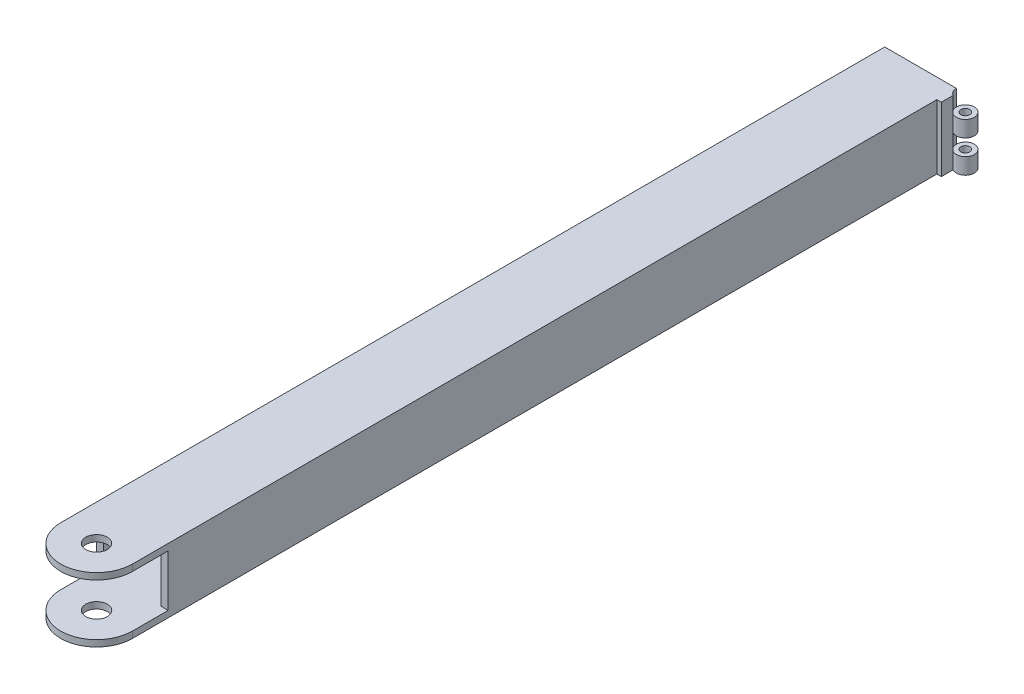
ISO-10303-21;
HEADER;
FILE_DESCRIPTION(('STEP AP214'),'2;1');
FILE_NAME('part.step','',(''),(''),'','','');
FILE_SCHEMA(('AUTOMOTIVE_DESIGN { 1 0 10303 214 1 1 1 1 }'));
ENDSEC;
DATA;
#1=APPLICATION_CONTEXT('core data for automotive mechanical design processes');
#2=APPLICATION_PROTOCOL_DEFINITION('international standard','automotive_design',2000,#1);
#3=PRODUCT_CONTEXT('',#1,'mechanical');
#4=PRODUCT('Part','Part','',(#3));
#5=PRODUCT_RELATED_PRODUCT_CATEGORY('part','',(#4));
#6=PRODUCT_DEFINITION_FORMATION('','',#4);
#7=PRODUCT_DEFINITION_CONTEXT('part definition',#1,'design');
#8=PRODUCT_DEFINITION('design','',#6,#7);
#9=PRODUCT_DEFINITION_SHAPE('','',#8);
#10=(LENGTH_UNIT() NAMED_UNIT(*) SI_UNIT(.MILLI.,.METRE.));
#11=(NAMED_UNIT(*) PLANE_ANGLE_UNIT() SI_UNIT($,.RADIAN.));
#12=(NAMED_UNIT(*) SI_UNIT($,.STERADIAN.) SOLID_ANGLE_UNIT());
#13=UNCERTAINTY_MEASURE_WITH_UNIT(LENGTH_MEASURE(1.E-05),#10,'distance_accuracy_value','');
#14=(GEOMETRIC_REPRESENTATION_CONTEXT(3) GLOBAL_UNCERTAINTY_ASSIGNED_CONTEXT((#13)) GLOBAL_UNIT_ASSIGNED_CONTEXT((#10,
#11,#12)) REPRESENTATION_CONTEXT('',''));
#15=CARTESIAN_POINT('',(0.,0.,0.));
#16=DIRECTION('',(0.,0.,1.));
#17=DIRECTION('',(1.,0.,0.));
#18=AXIS2_PLACEMENT_3D('',#15,#16,#17);
#19=CARTESIAN_POINT('',(25.,18.,0.));
#20=DIRECTION('',(0.,-1.,0.));
#21=DIRECTION('',(0.,0.,-1.));
#22=AXIS2_PLACEMENT_3D('',#19,#20,#21);
#23=CYLINDRICAL_SURFACE('',#22,5.);
#24=DIRECTION('',(0.,1.,0.));
#25=VECTOR('',#24,1.);
#26=CARTESIAN_POINT('',(20.,18.,0.));
#27=LINE('',#26,#25);
#28=CARTESIAN_POINT('',(20.,0.,0.));
#29=VERTEX_POINT('',#28);
#30=CARTESIAN_POINT('',(20.,9.,0.));
#31=VERTEX_POINT('',#30);
#32=EDGE_CURVE('E206',#29,#31,#27,.T.);
#33=ORIENTED_EDGE('',*,*,#32,.T.);
#34=CARTESIAN_POINT('',(25.,9.,0.));
#35=DIRECTION('',(0.,1.,0.));
#36=DIRECTION('',(0.,0.,1.));
#37=AXIS2_PLACEMENT_3D('',#34,#35,#36);
#38=CIRCLE('',#37,5.);
#39=CARTESIAN_POINT('',(22.5,9.,4.3301270189222));
#40=VERTEX_POINT('',#39);
#41=EDGE_CURVE('E194',#40,#31,#38,.T.);
#42=ORIENTED_EDGE('',*,*,#41,.F.);
#43=DIRECTION('',(0.,-1.,0.));
#44=VECTOR('',#43,1.);
#45=CARTESIAN_POINT('',(22.5,18.,4.33012701892219));
#46=LINE('',#45,#44);
#47=CARTESIAN_POINT('',(22.5,0.,4.33012701892219));
#48=VERTEX_POINT('',#47);
#49=EDGE_CURVE('E58',#40,#48,#46,.T.);
#50=ORIENTED_EDGE('',*,*,#49,.T.);
#51=CARTESIAN_POINT('',(25.,0.,0.));
#52=DIRECTION('',(0.,-1.,0.));
#53=DIRECTION('',(0.,0.,-1.));
#54=AXIS2_PLACEMENT_3D('',#51,#52,#53);
#55=CIRCLE('',#54,5.);
#56=EDGE_CURVE('E249',#29,#48,#55,.T.);
#57=ORIENTED_EDGE('',*,*,#56,.F.);
#58=EDGE_LOOP('',(#33,#42,#50,#57));
#59=FACE_BOUND('',#58,.T.);
#60=ADVANCED_FACE('F40',(#59),#23,.T.);
#61=CARTESIAN_POINT('',(25.,18.,0.));
#62=DIRECTION('',(0.,-1.,0.));
#63=DIRECTION('',(0.,0.,-1.));
#64=AXIS2_PLACEMENT_3D('',#61,#62,#63);
#65=CYLINDRICAL_SURFACE('',#64,2.5);
#66=CARTESIAN_POINT('',(25.,0.,0.));
#67=DIRECTION('',(0.,-1.,0.));
#68=DIRECTION('',(0.,0.,-1.));
#69=AXIS2_PLACEMENT_3D('',#66,#67,#68);
#70=CIRCLE('',#69,2.5);
#71=CARTESIAN_POINT('',(25.,0.,-2.5));
#72=VERTEX_POINT('',#71);
#73=EDGE_CURVE('E45',#72,#72,#70,.F.);
#74=ORIENTED_EDGE('',*,*,#73,.F.);
#75=EDGE_LOOP('',(#74));
#76=FACE_BOUND('',#75,.T.);
#77=CARTESIAN_POINT('',(25.,9.,0.));
#78=DIRECTION('',(0.,1.,0.));
#79=DIRECTION('',(0.,0.,1.));
#80=AXIS2_PLACEMENT_3D('',#77,#78,#79);
#81=CIRCLE('',#80,2.5);
#82=CARTESIAN_POINT('',(25.,9.,2.5));
#83=VERTEX_POINT('',#82);
#84=EDGE_CURVE('E182',#83,#83,#81,.F.);
#85=ORIENTED_EDGE('',*,*,#84,.F.);
#86=EDGE_LOOP('',(#85));
#87=FACE_BOUND('',#86,.T.);
#88=ADVANCED_FACE('F372',(#76,#87),#65,.F.);
#89=CARTESIAN_POINT('',(0.,14.4,460.));
#90=DIRECTION('',(0.,-1.,0.));
#91=DIRECTION('',(1.,0.,0.));
#92=AXIS2_PLACEMENT_3D('',#89,#90,#91);
#93=CYLINDRICAL_SURFACE('',#92,20.);
#94=DIRECTION('',(0.,1.,0.));
#95=VECTOR('',#94,1.);
#96=CARTESIAN_POINT('',(-20.,14.4,460.));
#97=LINE('',#96,#95);
#98=CARTESIAN_POINT('',(-20.,14.4,460.));
#99=VERTEX_POINT('',#98);
#100=CARTESIAN_POINT('',(-20.,18.,460.));
#101=VERTEX_POINT('',#100);
#102=EDGE_CURVE('E230',#99,#101,#97,.T.);
#103=ORIENTED_EDGE('',*,*,#102,.F.);
#104=CARTESIAN_POINT('',(0.,14.4,460.));
#105=DIRECTION('',(0.,-1.,0.));
#106=DIRECTION('',(0.,0.,-1.));
#107=AXIS2_PLACEMENT_3D('',#104,#105,#106);
#108=CIRCLE('',#107,20.);
#109=CARTESIAN_POINT('',(20.,14.4,460.));
#110=VERTEX_POINT('',#109);
#111=EDGE_CURVE('E50',#110,#99,#108,.T.);
#112=ORIENTED_EDGE('',*,*,#111,.F.);
#113=DIRECTION('',(0.,1.,0.));
#114=VECTOR('',#113,1.);
#115=CARTESIAN_POINT('',(20.,14.4,460.));
#116=LINE('',#115,#114);
#117=CARTESIAN_POINT('',(20.,18.,460.));
#118=VERTEX_POINT('',#117);
#119=EDGE_CURVE('E233',#118,#110,#116,.F.);
#120=ORIENTED_EDGE('',*,*,#119,.F.);
#121=CARTESIAN_POINT('',(0.,18.,460.));
#122=DIRECTION('',(0.,-1.,0.));
#123=DIRECTION('',(0.,0.,-1.));
#124=AXIS2_PLACEMENT_3D('',#121,#122,#123);
#125=CIRCLE('',#124,20.);
#126=EDGE_CURVE('E11',#101,#118,#125,.F.);
#127=ORIENTED_EDGE('',*,*,#126,.F.);
#128=EDGE_LOOP('',(#103,#112,#120,#127));
#129=FACE_BOUND('',#128,.T.);
#130=ADVANCED_FACE('F43',(#129),#93,.T.);
#131=CARTESIAN_POINT('',(0.,-18.,460.));
#132=DIRECTION('',(0.,-1.,0.));
#133=DIRECTION('',(1.,0.,0.));
#134=AXIS2_PLACEMENT_3D('',#131,#132,#133);
#135=CYLINDRICAL_SURFACE('',#134,20.);
#136=DIRECTION('',(0.,1.,0.));
#137=VECTOR('',#136,1.);
#138=CARTESIAN_POINT('',(-20.,-18.,460.));
#139=LINE('',#138,#137);
#140=CARTESIAN_POINT('',(-20.,-18.,460.));
#141=VERTEX_POINT('',#140);
#142=CARTESIAN_POINT('',(-20.,-14.4,460.));
#143=VERTEX_POINT('',#142);
#144=EDGE_CURVE('E220',#141,#143,#139,.T.);
#145=ORIENTED_EDGE('',*,*,#144,.F.);
#146=CARTESIAN_POINT('',(0.,-18.,460.));
#147=DIRECTION('',(0.,1.,0.));
#148=DIRECTION('',(0.,0.,1.));
#149=AXIS2_PLACEMENT_3D('',#146,#147,#148);
#150=CIRCLE('',#149,20.);
#151=CARTESIAN_POINT('',(20.,-18.,460.));
#152=VERTEX_POINT('',#151);
#153=EDGE_CURVE('E226',#152,#141,#150,.F.);
#154=ORIENTED_EDGE('',*,*,#153,.F.);
#155=DIRECTION('',(0.,1.,0.));
#156=VECTOR('',#155,1.);
#157=CARTESIAN_POINT('',(20.,-18.,460.));
#158=LINE('',#157,#156);
#159=CARTESIAN_POINT('',(20.,-14.4,460.));
#160=VERTEX_POINT('',#159);
#161=EDGE_CURVE('E223',#160,#152,#158,.F.);
#162=ORIENTED_EDGE('',*,*,#161,.F.);
#163=CARTESIAN_POINT('',(0.,-14.4,460.));
#164=DIRECTION('',(0.,1.,0.));
#165=DIRECTION('',(-1.,0.,0.));
#166=AXIS2_PLACEMENT_3D('',#163,#164,#165);
#167=CIRCLE('',#166,20.);
#168=EDGE_CURVE('E228',#143,#160,#167,.T.);
#169=ORIENTED_EDGE('',*,*,#168,.F.);
#170=EDGE_LOOP('',(#145,#154,#162,#169));
#171=FACE_BOUND('',#170,.T.);
#172=ADVANCED_FACE('F369',(#171),#135,.T.);
#173=CARTESIAN_POINT('',(0.,0.,0.));
#174=DIRECTION('',(0.,0.,1.));
#175=DIRECTION('',(1.,0.,0.));
#176=AXIS2_PLACEMENT_3D('',#173,#174,#175);
#177=PLANE('',#176);
#178=CARTESIAN_POINT('',(20.,-18.,0.));
#179=VERTEX_POINT('',#178);
#180=CARTESIAN_POINT('',(20.,-9.,0.));
#181=VERTEX_POINT('',#180);
#182=EDGE_CURVE('E201',#179,#181,#27,.T.);
#183=ORIENTED_EDGE('',*,*,#182,.F.);
#184=DIRECTION('',(1.,0.,0.));
#185=VECTOR('',#184,1.);
#186=CARTESIAN_POINT('',(-20.,-18.,0.));
#187=LINE('',#186,#185);
#188=CARTESIAN_POINT('',(-20.,-18.,0.));
#189=VERTEX_POINT('',#188);
#190=EDGE_CURVE('E203',#189,#179,#187,.T.);
#191=ORIENTED_EDGE('',*,*,#190,.F.);
#192=DIRECTION('',(0.,-1.,0.));
#193=VECTOR('',#192,1.);
#194=CARTESIAN_POINT('',(-20.,18.,0.));
#195=LINE('',#194,#193);
#196=CARTESIAN_POINT('',(-20.,18.,0.));
#197=VERTEX_POINT('',#196);
#198=EDGE_CURVE('E200',#197,#189,#195,.T.);
#199=ORIENTED_EDGE('',*,*,#198,.F.);
#200=DIRECTION('',(-1.,0.,0.));
#201=VECTOR('',#200,1.);
#202=CARTESIAN_POINT('',(-20.,18.,0.));
#203=LINE('',#202,#201);
#204=CARTESIAN_POINT('',(20.,18.,0.));
#205=VERTEX_POINT('',#204);
#206=EDGE_CURVE('E189',#205,#197,#203,.T.);
#207=ORIENTED_EDGE('',*,*,#206,.F.);
#208=DIRECTION('',(0.,1.,0.));
#209=VECTOR('',#208,1.);
#210=CARTESIAN_POINT('',(20.,9.,0.));
#211=LINE('',#210,#209);
#212=EDGE_CURVE('E170',#205,#31,#211,.F.);
#213=ORIENTED_EDGE('',*,*,#212,.T.);
#214=ORIENTED_EDGE('',*,*,#32,.F.);
#215=DIRECTION('',(0.,-1.,0.));
#216=VECTOR('',#215,1.);
#217=CARTESIAN_POINT('',(20.,0.,0.));
#218=LINE('',#217,#216);
#219=EDGE_CURVE('E247',#29,#181,#218,.T.);
#220=ORIENTED_EDGE('',*,*,#219,.T.);
#221=EDGE_LOOP('',(#183,#191,#199,#207,#213,#214,#220));
#222=FACE_BOUND('',#221,.T.);
#223=DIRECTION('',(0.,1.,0.));
#224=VECTOR('',#223,1.);
#225=CARTESIAN_POINT('',(16.,14.4,0.));
#226=LINE('',#225,#224);
#227=CARTESIAN_POINT('',(16.,-14.4,0.));
#228=VERTEX_POINT('',#227);
#229=CARTESIAN_POINT('',(16.,14.4,0.));
#230=VERTEX_POINT('',#229);
#231=EDGE_CURVE('E318',#228,#230,#226,.T.);
#232=ORIENTED_EDGE('',*,*,#231,.T.);
#233=DIRECTION('',(-1.,0.,0.));
#234=VECTOR('',#233,1.);
#235=CARTESIAN_POINT('',(-16.,14.4,0.));
#236=LINE('',#235,#234);
#237=CARTESIAN_POINT('',(-16.,14.4,0.));
#238=VERTEX_POINT('',#237);
#239=EDGE_CURVE('E321',#230,#238,#236,.T.);
#240=ORIENTED_EDGE('',*,*,#239,.T.);
#241=DIRECTION('',(0.,-1.,0.));
#242=VECTOR('',#241,1.);
#243=CARTESIAN_POINT('',(-16.,14.4,0.));
#244=LINE('',#243,#242);
#245=CARTESIAN_POINT('',(-16.,-14.4,0.));
#246=VERTEX_POINT('',#245);
#247=EDGE_CURVE('E324',#238,#246,#244,.T.);
#248=ORIENTED_EDGE('',*,*,#247,.T.);
#249=DIRECTION('',(1.,0.,0.));
#250=VECTOR('',#249,1.);
#251=CARTESIAN_POINT('',(-16.,-14.4,0.));
#252=LINE('',#251,#250);
#253=EDGE_CURVE('E327',#246,#228,#252,.T.);
#254=ORIENTED_EDGE('',*,*,#253,.T.);
#255=EDGE_LOOP('',(#232,#240,#248,#254));
#256=FACE_BOUND('',#255,.T.);
#257=ADVANCED_FACE('F196',(#222,#256),#177,.F.);
#258=CARTESIAN_POINT('',(20.,18.,480.));
#259=DIRECTION('',(-1.,0.,0.));
#260=DIRECTION('',(0.,-1.,0.));
#261=AXIS2_PLACEMENT_3D('',#258,#259,#260);
#262=PLANE('',#261);
#263=DIRECTION('',(0.,0.,-1.));
#264=VECTOR('',#263,1.);
#265=CARTESIAN_POINT('',(20.,-18.,480.));
#266=LINE('',#265,#264);
#267=CARTESIAN_POINT('',(20.,-18.,10.8981294611448));
#268=VERTEX_POINT('',#267);
#269=EDGE_CURVE('E212',#152,#268,#266,.T.);
#270=ORIENTED_EDGE('',*,*,#269,.T.);
#271=DIRECTION('',(0.,-1.,0.));
#272=VECTOR('',#271,1.);
#273=CARTESIAN_POINT('',(20.,18.,10.8981294611448));
#274=LINE('',#273,#272);
#275=CARTESIAN_POINT('',(20.,18.,10.8981294611448));
#276=VERTEX_POINT('',#275);
#277=EDGE_CURVE('E66',#276,#268,#274,.T.);
#278=ORIENTED_EDGE('',*,*,#277,.F.);
#279=DIRECTION('',(0.,0.,-1.));
#280=VECTOR('',#279,1.);
#281=CARTESIAN_POINT('',(20.,18.,480.));
#282=LINE('',#281,#280);
#283=EDGE_CURVE('E218',#118,#276,#282,.T.);
#284=ORIENTED_EDGE('',*,*,#283,.F.);
#285=ORIENTED_EDGE('',*,*,#119,.T.);
#286=DIRECTION('',(0.,0.,-1.));
#287=VECTOR('',#286,1.);
#288=CARTESIAN_POINT('',(20.,14.4,480.));
#289=LINE('',#288,#287);
#290=CARTESIAN_POINT('',(20.,14.4,440.));
#291=VERTEX_POINT('',#290);
#292=EDGE_CURVE('E311',#110,#291,#289,.T.);
#293=ORIENTED_EDGE('',*,*,#292,.T.);
#294=DIRECTION('',(0.,-1.,0.));
#295=VECTOR('',#294,1.);
#296=CARTESIAN_POINT('',(20.,18.,440.));
#297=LINE('',#296,#295);
#298=CARTESIAN_POINT('',(20.,-14.4,440.));
#299=VERTEX_POINT('',#298);
#300=EDGE_CURVE('E305',#291,#299,#297,.T.);
#301=ORIENTED_EDGE('',*,*,#300,.T.);
#302=DIRECTION('',(0.,0.,1.));
#303=VECTOR('',#302,1.);
#304=CARTESIAN_POINT('',(20.,-14.4,480.));
#305=LINE('',#304,#303);
#306=EDGE_CURVE('E315',#299,#160,#305,.T.);
#307=ORIENTED_EDGE('',*,*,#306,.T.);
#308=ORIENTED_EDGE('',*,*,#161,.T.);
#309=EDGE_LOOP('',(#270,#278,#284,#285,#293,#301,#307,#308));
#310=FACE_BOUND('',#309,.T.);
#311=ADVANCED_FACE('F360',(#310),#262,.F.);
#312=CARTESIAN_POINT('',(-20.,18.,480.));
#313=DIRECTION('',(0.,-1.,0.));
#314=DIRECTION('',(0.,0.,-1.));
#315=AXIS2_PLACEMENT_3D('',#312,#313,#314);
#316=PLANE('',#315);
#317=CARTESIAN_POINT('',(0.,18.,460.));
#318=DIRECTION('',(0.,-1.,0.));
#319=DIRECTION('',(0.,0.,-1.));
#320=AXIS2_PLACEMENT_3D('',#317,#318,#319);
#321=CIRCLE('',#320,6.00000000000001);
#322=CARTESIAN_POINT('',(0.,18.,454.));
#323=VERTEX_POINT('',#322);
#324=EDGE_CURVE('E287',#323,#323,#321,.T.);
#325=ORIENTED_EDGE('',*,*,#324,.T.);
#326=EDGE_LOOP('',(#325));
#327=FACE_BOUND('',#326,.T.);
#328=DIRECTION('',(0.,0.,1.));
#329=VECTOR('',#328,1.);
#330=CARTESIAN_POINT('',(22.5,18.,10.8981294611448));
#331=LINE('',#330,#329);
#332=CARTESIAN_POINT('',(22.5,18.,4.33012701892219));
#333=VERTEX_POINT('',#332);
#334=CARTESIAN_POINT('',(22.5,18.,10.8981294611448));
#335=VERTEX_POINT('',#334);
#336=EDGE_CURVE('E193',#333,#335,#331,.T.);
#337=ORIENTED_EDGE('',*,*,#336,.F.);
#338=CARTESIAN_POINT('',(25.,18.,0.));
#339=DIRECTION('',(0.,1.,0.));
#340=DIRECTION('',(0.,0.,1.));
#341=AXIS2_PLACEMENT_3D('',#338,#339,#340);
#342=CIRCLE('',#341,5.);
#343=EDGE_CURVE('E173',#205,#333,#342,.T.);
#344=ORIENTED_EDGE('',*,*,#343,.F.);
#345=ORIENTED_EDGE('',*,*,#206,.T.);
#346=DIRECTION('',(0.,0.,-1.));
#347=VECTOR('',#346,1.);
#348=CARTESIAN_POINT('',(-20.,18.,480.));
#349=LINE('',#348,#347);
#350=EDGE_CURVE('E216',#101,#197,#349,.T.);
#351=ORIENTED_EDGE('',*,*,#350,.F.);
#352=ORIENTED_EDGE('',*,*,#126,.T.);
#353=ORIENTED_EDGE('',*,*,#283,.T.);
#354=DIRECTION('',(-1.,0.,0.));
#355=VECTOR('',#354,1.);
#356=CARTESIAN_POINT('',(20.,18.,10.8981294611448));
#357=LINE('',#356,#355);
#358=EDGE_CURVE('E265',#335,#276,#357,.T.);
#359=ORIENTED_EDGE('',*,*,#358,.F.);
#360=EDGE_LOOP('',(#337,#344,#345,#351,#352,#353,#359));
#361=FACE_BOUND('',#360,.T.);
#362=ADVANCED_FACE('F187',(#327,#361),#316,.F.);
#363=CARTESIAN_POINT('',(-20.,18.,480.));
#364=DIRECTION('',(1.,0.,0.));
#365=DIRECTION('',(0.,1.,0.));
#366=AXIS2_PLACEMENT_3D('',#363,#364,#365);
#367=PLANE('',#366);
#368=DIRECTION('',(0.,0.,1.));
#369=VECTOR('',#368,1.);
#370=CARTESIAN_POINT('',(-20.,14.4,480.));
#371=LINE('',#370,#369);
#372=CARTESIAN_POINT('',(-20.,14.4,440.));
#373=VERTEX_POINT('',#372);
#374=EDGE_CURVE('E308',#373,#99,#371,.T.);
#375=ORIENTED_EDGE('',*,*,#374,.T.);
#376=ORIENTED_EDGE('',*,*,#102,.T.);
#377=ORIENTED_EDGE('',*,*,#350,.T.);
#378=ORIENTED_EDGE('',*,*,#198,.T.);
#379=DIRECTION('',(0.,0.,-1.));
#380=VECTOR('',#379,1.);
#381=CARTESIAN_POINT('',(-20.,-18.,480.));
#382=LINE('',#381,#380);
#383=EDGE_CURVE('E214',#141,#189,#382,.T.);
#384=ORIENTED_EDGE('',*,*,#383,.F.);
#385=ORIENTED_EDGE('',*,*,#144,.T.);
#386=DIRECTION('',(0.,0.,-1.));
#387=VECTOR('',#386,1.);
#388=CARTESIAN_POINT('',(-20.,-14.4,480.));
#389=LINE('',#388,#387);
#390=CARTESIAN_POINT('',(-20.,-14.4,440.));
#391=VERTEX_POINT('',#390);
#392=EDGE_CURVE('E313',#143,#391,#389,.T.);
#393=ORIENTED_EDGE('',*,*,#392,.T.);
#394=DIRECTION('',(0.,1.,0.));
#395=VECTOR('',#394,1.);
#396=CARTESIAN_POINT('',(-20.,18.,440.));
#397=LINE('',#396,#395);
#398=EDGE_CURVE('E302',#391,#373,#397,.T.);
#399=ORIENTED_EDGE('',*,*,#398,.T.);
#400=EDGE_LOOP('',(#375,#376,#377,#378,#384,#385,#393,#399));
#401=FACE_BOUND('',#400,.T.);
#402=ADVANCED_FACE('F355',(#401),#367,.F.);
#403=CARTESIAN_POINT('',(-20.,-18.,480.));
#404=DIRECTION('',(0.,1.,0.));
#405=DIRECTION('',(0.,0.,1.));
#406=AXIS2_PLACEMENT_3D('',#403,#404,#405);
#407=PLANE('',#406);
#408=CARTESIAN_POINT('',(0.,-18.,460.));
#409=DIRECTION('',(0.,1.,0.));
#410=DIRECTION('',(0.,0.,1.));
#411=AXIS2_PLACEMENT_3D('',#408,#409,#410);
#412=CIRCLE('',#411,6.00000000000001);
#413=CARTESIAN_POINT('',(0.,-18.,466.));
#414=VERTEX_POINT('',#413);
#415=EDGE_CURVE('E240',#414,#414,#412,.T.);
#416=ORIENTED_EDGE('',*,*,#415,.T.);
#417=EDGE_LOOP('',(#416));
#418=FACE_BOUND('',#417,.T.);
#419=ORIENTED_EDGE('',*,*,#269,.F.);
#420=ORIENTED_EDGE('',*,*,#153,.T.);
#421=ORIENTED_EDGE('',*,*,#383,.T.);
#422=ORIENTED_EDGE('',*,*,#190,.T.);
#423=CARTESIAN_POINT('',(25.,-18.,0.));
#424=DIRECTION('',(0.,-1.,0.));
#425=DIRECTION('',(0.,0.,-1.));
#426=AXIS2_PLACEMENT_3D('',#423,#424,#425);
#427=CIRCLE('',#426,5.);
#428=CARTESIAN_POINT('',(22.5,-18.,4.33012701892219));
#429=VERTEX_POINT('',#428);
#430=EDGE_CURVE('E263',#179,#429,#427,.T.);
#431=ORIENTED_EDGE('',*,*,#430,.T.);
#432=DIRECTION('',(0.,0.,1.));
#433=VECTOR('',#432,1.);
#434=CARTESIAN_POINT('',(22.5,-18.,10.8981294611448));
#435=LINE('',#434,#433);
#436=CARTESIAN_POINT('',(22.5,-18.,10.8981294611448));
#437=VERTEX_POINT('',#436);
#438=EDGE_CURVE('E272',#429,#437,#435,.T.);
#439=ORIENTED_EDGE('',*,*,#438,.T.);
#440=DIRECTION('',(-1.,0.,0.));
#441=VECTOR('',#440,1.);
#442=CARTESIAN_POINT('',(20.,-18.,10.8981294611448));
#443=LINE('',#442,#441);
#444=EDGE_CURVE('E266',#437,#268,#443,.T.);
#445=ORIENTED_EDGE('',*,*,#444,.T.);
#446=EDGE_LOOP('',(#419,#420,#421,#422,#431,#439,#445));
#447=FACE_BOUND('',#446,.T.);
#448=CARTESIAN_POINT('',(25.,-18.,0.));
#449=DIRECTION('',(0.,-1.,0.));
#450=DIRECTION('',(0.,0.,-1.));
#451=AXIS2_PLACEMENT_3D('',#448,#449,#450);
#452=CIRCLE('',#451,2.5);
#453=CARTESIAN_POINT('',(25.,-18.,-2.5));
#454=VERTEX_POINT('',#453);
#455=EDGE_CURVE('E260',#454,#454,#452,.T.);
#456=ORIENTED_EDGE('',*,*,#455,.F.);
#457=EDGE_LOOP('',(#456));
#458=FACE_BOUND('',#457,.T.);
#459=ADVANCED_FACE('F350',(#418,#447,#458),#407,.F.);
#460=CARTESIAN_POINT('',(16.,14.4,480.));
#461=DIRECTION('',(-1.,0.,0.));
#462=DIRECTION('',(0.,-1.,0.));
#463=AXIS2_PLACEMENT_3D('',#460,#461,#462);
#464=PLANE('',#463);
#465=DIRECTION('',(0.,-1.,0.));
#466=VECTOR('',#465,1.);
#467=CARTESIAN_POINT('',(16.,14.4,440.));
#468=LINE('',#467,#466);
#469=CARTESIAN_POINT('',(16.,14.4,440.));
#470=VERTEX_POINT('',#469);
#471=CARTESIAN_POINT('',(16.,-14.4,440.));
#472=VERTEX_POINT('',#471);
#473=EDGE_CURVE('E300',#470,#472,#468,.T.);
#474=ORIENTED_EDGE('',*,*,#473,.F.);
#475=DIRECTION('',(0.,0.,-1.));
#476=VECTOR('',#475,1.);
#477=CARTESIAN_POINT('',(16.,14.4,480.));
#478=LINE('',#477,#476);
#479=EDGE_CURVE('E335',#470,#230,#478,.T.);
#480=ORIENTED_EDGE('',*,*,#479,.T.);
#481=ORIENTED_EDGE('',*,*,#231,.F.);
#482=DIRECTION('',(0.,0.,-1.));
#483=VECTOR('',#482,1.);
#484=CARTESIAN_POINT('',(16.,-14.4,480.));
#485=LINE('',#484,#483);
#486=EDGE_CURVE('E330',#472,#228,#485,.T.);
#487=ORIENTED_EDGE('',*,*,#486,.F.);
#488=EDGE_LOOP('',(#474,#480,#481,#487));
#489=FACE_BOUND('',#488,.T.);
#490=ADVANCED_FACE('F416',(#489),#464,.T.);
#491=CARTESIAN_POINT('',(-16.,14.4,480.));
#492=DIRECTION('',(0.,-1.,0.));
#493=DIRECTION('',(0.,0.,-1.));
#494=AXIS2_PLACEMENT_3D('',#491,#492,#493);
#495=PLANE('',#494);
#496=CARTESIAN_POINT('',(0.,14.4,460.));
#497=DIRECTION('',(0.,-1.,0.));
#498=DIRECTION('',(0.,0.,-1.));
#499=AXIS2_PLACEMENT_3D('',#496,#497,#498);
#500=CIRCLE('',#499,6.00000000000001);
#501=CARTESIAN_POINT('',(0.,14.4,454.));
#502=VERTEX_POINT('',#501);
#503=EDGE_CURVE('E239',#502,#502,#500,.T.);
#504=ORIENTED_EDGE('',*,*,#503,.F.);
#505=EDGE_LOOP('',(#504));
#506=FACE_BOUND('',#505,.T.);
#507=ORIENTED_EDGE('',*,*,#292,.F.);
#508=ORIENTED_EDGE('',*,*,#111,.T.);
#509=ORIENTED_EDGE('',*,*,#374,.F.);
#510=DIRECTION('',(-1.,0.,0.));
#511=VECTOR('',#510,1.);
#512=CARTESIAN_POINT('',(-25.,14.4,440.));
#513=LINE('',#512,#511);
#514=CARTESIAN_POINT('',(-16.,14.4,440.));
#515=VERTEX_POINT('',#514);
#516=EDGE_CURVE('E290',#515,#373,#513,.T.);
#517=ORIENTED_EDGE('',*,*,#516,.F.);
#518=DIRECTION('',(0.,0.,-1.));
#519=VECTOR('',#518,1.);
#520=CARTESIAN_POINT('',(-16.,14.4,480.));
#521=LINE('',#520,#519);
#522=EDGE_CURVE('E334',#515,#238,#521,.T.);
#523=ORIENTED_EDGE('',*,*,#522,.T.);
#524=ORIENTED_EDGE('',*,*,#239,.F.);
#525=ORIENTED_EDGE('',*,*,#479,.F.);
#526=EDGE_CURVE('E293',#291,#470,#513,.T.);
#527=ORIENTED_EDGE('',*,*,#526,.F.);
#528=EDGE_LOOP('',(#507,#508,#509,#517,#523,#524,#525,#527));
#529=FACE_BOUND('',#528,.T.);
#530=ADVANCED_FACE('F412',(#506,#529),#495,.T.);
#531=CARTESIAN_POINT('',(-16.,14.4,480.));
#532=DIRECTION('',(1.,0.,0.));
#533=DIRECTION('',(0.,1.,0.));
#534=AXIS2_PLACEMENT_3D('',#531,#532,#533);
#535=PLANE('',#534);
#536=DIRECTION('',(0.,1.,0.));
#537=VECTOR('',#536,1.);
#538=CARTESIAN_POINT('',(-16.,14.4,440.));
#539=LINE('',#538,#537);
#540=CARTESIAN_POINT('',(-16.,-14.4,440.));
#541=VERTEX_POINT('',#540);
#542=EDGE_CURVE('E298',#541,#515,#539,.T.);
#543=ORIENTED_EDGE('',*,*,#542,.F.);
#544=DIRECTION('',(0.,0.,-1.));
#545=VECTOR('',#544,1.);
#546=CARTESIAN_POINT('',(-16.,-14.4,480.));
#547=LINE('',#546,#545);
#548=EDGE_CURVE('E332',#541,#246,#547,.T.);
#549=ORIENTED_EDGE('',*,*,#548,.T.);
#550=ORIENTED_EDGE('',*,*,#247,.F.);
#551=ORIENTED_EDGE('',*,*,#522,.F.);
#552=EDGE_LOOP('',(#543,#549,#550,#551));
#553=FACE_BOUND('',#552,.T.);
#554=ADVANCED_FACE('F408',(#553),#535,.T.);
#555=CARTESIAN_POINT('',(-16.,-14.4,480.));
#556=DIRECTION('',(0.,1.,0.));
#557=DIRECTION('',(-1.,0.,0.));
#558=AXIS2_PLACEMENT_3D('',#555,#556,#557);
#559=PLANE('',#558);
#560=CARTESIAN_POINT('',(0.,-14.4,460.));
#561=DIRECTION('',(0.,1.,0.));
#562=DIRECTION('',(-1.,0.,0.));
#563=AXIS2_PLACEMENT_3D('',#560,#561,#562);
#564=CIRCLE('',#563,6.00000000000001);
#565=CARTESIAN_POINT('',(-6.00000000000001,-14.4,460.));
#566=VERTEX_POINT('',#565);
#567=EDGE_CURVE('E237',#566,#566,#564,.T.);
#568=ORIENTED_EDGE('',*,*,#567,.F.);
#569=EDGE_LOOP('',(#568));
#570=FACE_BOUND('',#569,.T.);
#571=ORIENTED_EDGE('',*,*,#392,.F.);
#572=ORIENTED_EDGE('',*,*,#168,.T.);
#573=ORIENTED_EDGE('',*,*,#306,.F.);
#574=DIRECTION('',(1.,0.,0.));
#575=VECTOR('',#574,1.);
#576=CARTESIAN_POINT('',(-25.,-14.4,440.));
#577=LINE('',#576,#575);
#578=EDGE_CURVE('E294',#472,#299,#577,.T.);
#579=ORIENTED_EDGE('',*,*,#578,.F.);
#580=ORIENTED_EDGE('',*,*,#486,.T.);
#581=ORIENTED_EDGE('',*,*,#253,.F.);
#582=ORIENTED_EDGE('',*,*,#548,.F.);
#583=EDGE_CURVE('E297',#391,#541,#577,.T.);
#584=ORIENTED_EDGE('',*,*,#583,.F.);
#585=EDGE_LOOP('',(#571,#572,#573,#579,#580,#581,#582,#584));
#586=FACE_BOUND('',#585,.T.);
#587=ADVANCED_FACE('F405',(#570,#586),#559,.T.);
#588=CARTESIAN_POINT('',(0.,0.,440.));
#589=DIRECTION('',(0.,0.,-1.));
#590=DIRECTION('',(-1.,0.,0.));
#591=AXIS2_PLACEMENT_3D('',#588,#589,#590);
#592=PLANE('',#591);
#593=ORIENTED_EDGE('',*,*,#583,.T.);
#594=ORIENTED_EDGE('',*,*,#542,.T.);
#595=ORIENTED_EDGE('',*,*,#516,.T.);
#596=ORIENTED_EDGE('',*,*,#398,.F.);
#597=EDGE_LOOP('',(#593,#594,#595,#596));
#598=FACE_BOUND('',#597,.T.);
#599=ADVANCED_FACE('F403',(#598),#592,.F.);
#600=ORIENTED_EDGE('',*,*,#526,.T.);
#601=ORIENTED_EDGE('',*,*,#473,.T.);
#602=ORIENTED_EDGE('',*,*,#578,.T.);
#603=ORIENTED_EDGE('',*,*,#300,.F.);
#604=EDGE_LOOP('',(#600,#601,#602,#603));
#605=FACE_BOUND('',#604,.T.);
#606=ADVANCED_FACE('F397',(#605),#592,.F.);
#607=CARTESIAN_POINT('',(0.,-18.,460.));
#608=DIRECTION('',(0.,1.,0.));
#609=DIRECTION('',(0.,0.,1.));
#610=AXIS2_PLACEMENT_3D('',#607,#608,#609);
#611=CYLINDRICAL_SURFACE('',#610,6.00000000000001);
#612=ORIENTED_EDGE('',*,*,#567,.T.);
#613=EDGE_LOOP('',(#612));
#614=FACE_BOUND('',#613,.T.);
#615=ORIENTED_EDGE('',*,*,#415,.F.);
#616=EDGE_LOOP('',(#615));
#617=FACE_BOUND('',#616,.T.);
#618=ADVANCED_FACE('F392',(#614,#617),#611,.F.);
#619=ORIENTED_EDGE('',*,*,#503,.T.);
#620=EDGE_LOOP('',(#619));
#621=FACE_BOUND('',#620,.T.);
#622=ORIENTED_EDGE('',*,*,#324,.F.);
#623=EDGE_LOOP('',(#622));
#624=FACE_BOUND('',#623,.T.);
#625=ADVANCED_FACE('F384',(#621,#624),#611,.F.);
#626=CARTESIAN_POINT('',(25.,-9.,0.));
#627=DIRECTION('',(0.,-1.,0.));
#628=DIRECTION('',(0.,0.,-1.));
#629=AXIS2_PLACEMENT_3D('',#626,#627,#628);
#630=CIRCLE('',#629,5.);
#631=CARTESIAN_POINT('',(22.5,-9.,4.33012701892219));
#632=VERTEX_POINT('',#631);
#633=EDGE_CURVE('E181',#181,#632,#630,.T.);
#634=ORIENTED_EDGE('',*,*,#633,.T.);
#635=EDGE_CURVE('E269',#632,#429,#46,.T.);
#636=ORIENTED_EDGE('',*,*,#635,.T.);
#637=ORIENTED_EDGE('',*,*,#430,.F.);
#638=ORIENTED_EDGE('',*,*,#182,.T.);
#639=EDGE_LOOP('',(#634,#636,#637,#638));
#640=FACE_BOUND('',#639,.T.);
#641=ADVANCED_FACE('F345',(#640),#23,.T.);
#642=CARTESIAN_POINT('',(20.,18.,10.8981294611448));
#643=DIRECTION('',(0.,0.,1.));
#644=DIRECTION('',(1.,0.,0.));
#645=AXIS2_PLACEMENT_3D('',#642,#643,#644);
#646=PLANE('',#645);
#647=ORIENTED_EDGE('',*,*,#444,.F.);
#648=DIRECTION('',(0.,-1.,0.));
#649=VECTOR('',#648,1.);
#650=CARTESIAN_POINT('',(22.5,18.,10.8981294611448));
#651=LINE('',#650,#649);
#652=EDGE_CURVE('E278',#335,#437,#651,.T.);
#653=ORIENTED_EDGE('',*,*,#652,.F.);
#654=ORIENTED_EDGE('',*,*,#358,.T.);
#655=ORIENTED_EDGE('',*,*,#277,.T.);
#656=EDGE_LOOP('',(#647,#653,#654,#655));
#657=FACE_BOUND('',#656,.T.);
#658=ADVANCED_FACE('F383',(#657),#646,.T.);
#659=CARTESIAN_POINT('',(22.5,18.,10.8981294611448));
#660=DIRECTION('',(1.,0.,0.));
#661=DIRECTION('',(0.,0.,-1.));
#662=AXIS2_PLACEMENT_3D('',#659,#660,#661);
#663=PLANE('',#662);
#664=ORIENTED_EDGE('',*,*,#438,.F.);
#665=ORIENTED_EDGE('',*,*,#635,.F.);
#666=EDGE_CURVE('E282',#48,#632,#46,.T.);
#667=ORIENTED_EDGE('',*,*,#666,.F.);
#668=ORIENTED_EDGE('',*,*,#49,.F.);
#669=EDGE_CURVE('E280',#333,#40,#46,.T.);
#670=ORIENTED_EDGE('',*,*,#669,.F.);
#671=ORIENTED_EDGE('',*,*,#336,.T.);
#672=ORIENTED_EDGE('',*,*,#652,.T.);
#673=EDGE_LOOP('',(#664,#665,#667,#668,#670,#671,#672));
#674=FACE_BOUND('',#673,.T.);
#675=ADVANCED_FACE('F389',(#674),#663,.T.);
#676=CARTESIAN_POINT('',(25.,-9.,0.));
#677=DIRECTION('',(0.,-1.,0.));
#678=DIRECTION('',(0.,0.,-1.));
#679=AXIS2_PLACEMENT_3D('',#676,#677,#678);
#680=CIRCLE('',#679,2.5);
#681=CARTESIAN_POINT('',(25.,-9.,-2.5));
#682=VERTEX_POINT('',#681);
#683=EDGE_CURVE('E241',#682,#682,#680,.F.);
#684=ORIENTED_EDGE('',*,*,#683,.T.);
#685=EDGE_LOOP('',(#684));
#686=FACE_BOUND('',#685,.T.);
#687=ORIENTED_EDGE('',*,*,#455,.T.);
#688=EDGE_LOOP('',(#687));
#689=FACE_BOUND('',#688,.T.);
#690=ADVANCED_FACE('F379',(#686,#689),#65,.F.);
#691=CARTESIAN_POINT('',(25.,0.,0.));
#692=DIRECTION('',(0.,-1.,0.));
#693=DIRECTION('',(0.,0.,-1.));
#694=AXIS2_PLACEMENT_3D('',#691,#692,#693);
#695=CYLINDRICAL_SURFACE('',#694,5.);
#696=EDGE_CURVE('E243',#48,#29,#55,.T.);
#697=ORIENTED_EDGE('',*,*,#696,.F.);
#698=ORIENTED_EDGE('',*,*,#666,.T.);
#699=EDGE_CURVE('E253',#632,#181,#630,.T.);
#700=ORIENTED_EDGE('',*,*,#699,.T.);
#701=ORIENTED_EDGE('',*,*,#219,.F.);
#702=EDGE_LOOP('',(#697,#698,#700,#701));
#703=FACE_BOUND('',#702,.T.);
#704=ADVANCED_FACE('F570',(#703),#695,.F.);
#705=CARTESIAN_POINT('',(25.,0.,0.));
#706=DIRECTION('',(0.,-1.,0.));
#707=DIRECTION('',(0.,0.,-1.));
#708=AXIS2_PLACEMENT_3D('',#705,#706,#707);
#709=PLANE('',#708);
#710=ORIENTED_EDGE('',*,*,#696,.T.);
#711=ORIENTED_EDGE('',*,*,#56,.T.);
#712=EDGE_LOOP('',(#710,#711));
#713=FACE_BOUND('',#712,.T.);
#714=ORIENTED_EDGE('',*,*,#73,.T.);
#715=EDGE_LOOP('',(#714));
#716=FACE_BOUND('',#715,.T.);
#717=ADVANCED_FACE('F567',(#713,#716),#709,.T.);
#718=CARTESIAN_POINT('',(25.,-9.,0.));
#719=DIRECTION('',(0.,-1.,0.));
#720=DIRECTION('',(0.,0.,-1.));
#721=AXIS2_PLACEMENT_3D('',#718,#719,#720);
#722=PLANE('',#721);
#723=ORIENTED_EDGE('',*,*,#699,.F.);
#724=ORIENTED_EDGE('',*,*,#633,.F.);
#725=EDGE_LOOP('',(#723,#724));
#726=FACE_BOUND('',#725,.T.);
#727=ORIENTED_EDGE('',*,*,#683,.F.);
#728=EDGE_LOOP('',(#727));
#729=FACE_BOUND('',#728,.T.);
#730=ADVANCED_FACE('F550',(#726,#729),#722,.F.);
#731=CARTESIAN_POINT('',(25.,9.,0.));
#732=DIRECTION('',(0.,1.,0.));
#733=DIRECTION('',(0.,0.,1.));
#734=AXIS2_PLACEMENT_3D('',#731,#732,#733);
#735=CYLINDRICAL_SURFACE('',#734,5.);
#736=ORIENTED_EDGE('',*,*,#343,.T.);
#737=ORIENTED_EDGE('',*,*,#669,.T.);
#738=EDGE_CURVE('E176',#31,#40,#38,.T.);
#739=ORIENTED_EDGE('',*,*,#738,.F.);
#740=ORIENTED_EDGE('',*,*,#212,.F.);
#741=EDGE_LOOP('',(#736,#737,#739,#740));
#742=FACE_BOUND('',#741,.T.);
#743=ADVANCED_FACE('F172',(#742),#735,.F.);
#744=CARTESIAN_POINT('',(25.,9.,0.));
#745=DIRECTION('',(0.,1.,0.));
#746=DIRECTION('',(0.,0.,1.));
#747=AXIS2_PLACEMENT_3D('',#744,#745,#746);
#748=PLANE('',#747);
#749=ORIENTED_EDGE('',*,*,#738,.T.);
#750=ORIENTED_EDGE('',*,*,#41,.T.);
#751=EDGE_LOOP('',(#749,#750));
#752=FACE_BOUND('',#751,.T.);
#753=ORIENTED_EDGE('',*,*,#84,.T.);
#754=EDGE_LOOP('',(#753));
#755=FACE_BOUND('',#754,.T.);
#756=ADVANCED_FACE('F549',(#752,#755),#748,.T.);
#757=CLOSED_SHELL('',(#60,#88,#130,#172,#257,#311,#362,#402,#459,#490,#530,#554,#587,#599,#606,
#618,#625,#641,#658,#675,#690,#704,#717,#730,#743,#756));
#758=MANIFOLD_SOLID_BREP('B2',#757);
#759=ADVANCED_BREP_SHAPE_REPRESENTATION('',(#18,#758),#14);
#760=SHAPE_DEFINITION_REPRESENTATION(#9,#759);
ENDSEC;
END-ISO-10303-21;
